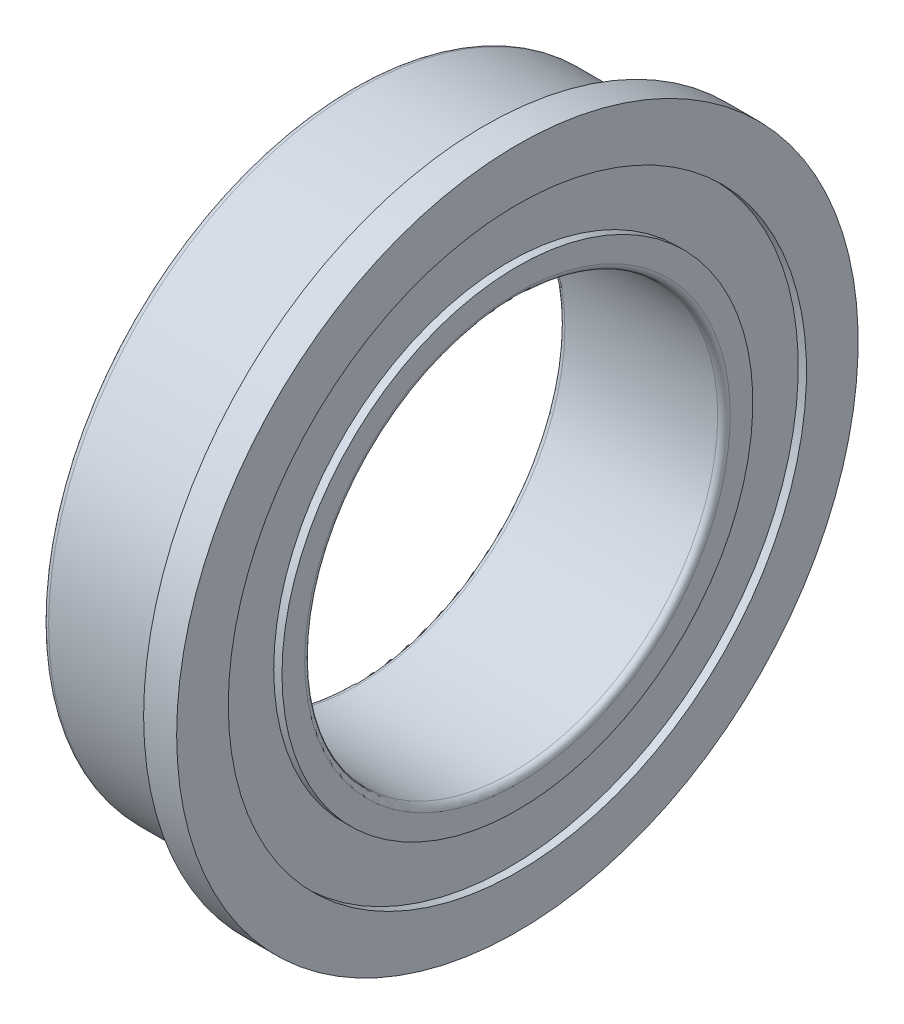
ISO-10303-21;
HEADER;
FILE_DESCRIPTION(('STEP AP214'),'2;1');
FILE_NAME('part.step','',(''),(''),'','','');
FILE_SCHEMA(('AUTOMOTIVE_DESIGN { 1 0 10303 214 1 1 1 1 }'));
ENDSEC;
DATA;
#1=APPLICATION_CONTEXT('core data for automotive mechanical design processes');
#2=APPLICATION_PROTOCOL_DEFINITION('international standard','automotive_design',2000,#1);
#3=PRODUCT_CONTEXT('',#1,'mechanical');
#4=PRODUCT('Part','Part','',(#3));
#5=PRODUCT_RELATED_PRODUCT_CATEGORY('part','',(#4));
#6=PRODUCT_DEFINITION_FORMATION('','',#4);
#7=PRODUCT_DEFINITION_CONTEXT('part definition',#1,'design');
#8=PRODUCT_DEFINITION('design','',#6,#7);
#9=PRODUCT_DEFINITION_SHAPE('','',#8);
#10=(LENGTH_UNIT() NAMED_UNIT(*) SI_UNIT(.MILLI.,.METRE.));
#11=(NAMED_UNIT(*) PLANE_ANGLE_UNIT() SI_UNIT($,.RADIAN.));
#12=(NAMED_UNIT(*) SI_UNIT($,.STERADIAN.) SOLID_ANGLE_UNIT());
#13=UNCERTAINTY_MEASURE_WITH_UNIT(LENGTH_MEASURE(1.E-05),#10,'distance_accuracy_value','');
#14=(GEOMETRIC_REPRESENTATION_CONTEXT(3) GLOBAL_UNCERTAINTY_ASSIGNED_CONTEXT((#13)) GLOBAL_UNIT_ASSIGNED_CONTEXT((#10,
#11,#12)) REPRESENTATION_CONTEXT('',''));
#15=CARTESIAN_POINT('',(0.,0.,0.));
#16=DIRECTION('',(0.,0.,1.));
#17=DIRECTION('',(1.,0.,0.));
#18=AXIS2_PLACEMENT_3D('',#15,#16,#17);
#19=CARTESIAN_POINT('',(-3.2,0.,0.));
#20=DIRECTION('',(-1.,0.,0.));
#21=DIRECTION('',(0.,0.,1.));
#22=AXIS2_PLACEMENT_3D('',#19,#20,#21);
#23=CYLINDRICAL_SURFACE('',#22,8.25);
#24=CARTESIAN_POINT('',(0.,0.,0.));
#25=DIRECTION('',(-1.,0.,0.));
#26=DIRECTION('',(0.,0.,1.));
#27=AXIS2_PLACEMENT_3D('',#24,#25,#26);
#28=CIRCLE('',#27,8.25);
#29=CARTESIAN_POINT('',(0.,0.,8.25));
#30=VERTEX_POINT('',#29);
#31=EDGE_CURVE('E75',#30,#30,#28,.T.);
#32=ORIENTED_EDGE('',*,*,#31,.F.);
#33=EDGE_LOOP('',(#32));
#34=FACE_BOUND('',#33,.T.);
#35=CARTESIAN_POINT('',(0.799999999999999,0.,0.));
#36=DIRECTION('',(-1.,0.,0.));
#37=DIRECTION('',(0.,0.,1.));
#38=AXIS2_PLACEMENT_3D('',#35,#36,#37);
#39=CIRCLE('',#38,8.25);
#40=CARTESIAN_POINT('',(0.799999999999999,0.,8.25));
#41=VERTEX_POINT('',#40);
#42=EDGE_CURVE('E118',#41,#41,#39,.T.);
#43=ORIENTED_EDGE('',*,*,#42,.T.);
#44=EDGE_LOOP('',(#43));
#45=FACE_BOUND('',#44,.T.);
#46=ADVANCED_FACE('F41',(#34,#45),#23,.T.);
#47=CARTESIAN_POINT('',(0.,7.7,0.));
#48=DIRECTION('',(1.,0.,0.));
#49=DIRECTION('',(0.,0.,-1.));
#50=AXIS2_PLACEMENT_3D('',#47,#48,#49);
#51=PLANE('',#50);
#52=CARTESIAN_POINT('',(0.,0.,0.));
#53=DIRECTION('',(-1.,0.,0.));
#54=DIRECTION('',(0.,0.,1.));
#55=AXIS2_PLACEMENT_3D('',#52,#53,#54);
#56=CIRCLE('',#55,7.7);
#57=CARTESIAN_POINT('',(0.,0.,7.7));
#58=VERTEX_POINT('',#57);
#59=EDGE_CURVE('E79',#58,#58,#56,.T.);
#60=ORIENTED_EDGE('',*,*,#59,.F.);
#61=EDGE_LOOP('',(#60));
#62=FACE_BOUND('',#61,.T.);
#63=ORIENTED_EDGE('',*,*,#31,.T.);
#64=EDGE_LOOP('',(#63));
#65=FACE_BOUND('',#64,.T.);
#66=ADVANCED_FACE('F160',(#62,#65),#51,.F.);
#67=CARTESIAN_POINT('',(0.,0.,0.));
#68=DIRECTION('',(-1.,0.,0.));
#69=DIRECTION('',(0.,0.,1.));
#70=AXIS2_PLACEMENT_3D('',#67,#68,#69);
#71=TOROIDAL_SURFACE('',#70,7.5,0.2);
#72=CARTESIAN_POINT('',(-0.2,0.,0.));
#73=DIRECTION('',(-1.,0.,0.));
#74=DIRECTION('',(0.,0.,1.));
#75=AXIS2_PLACEMENT_3D('',#72,#73,#74);
#76=CIRCLE('',#75,7.5);
#77=CARTESIAN_POINT('',(-0.2,0.,7.5));
#78=VERTEX_POINT('',#77);
#79=EDGE_CURVE('E83',#78,#78,#76,.T.);
#80=ORIENTED_EDGE('',*,*,#79,.F.);
#81=EDGE_LOOP('',(#80));
#82=FACE_BOUND('',#81,.T.);
#83=ORIENTED_EDGE('',*,*,#59,.T.);
#84=EDGE_LOOP('',(#83));
#85=FACE_BOUND('',#84,.T.);
#86=ADVANCED_FACE('F166',(#82,#85),#71,.F.);
#87=CARTESIAN_POINT('',(-3.2,0.,0.));
#88=DIRECTION('',(-1.,0.,0.));
#89=DIRECTION('',(0.,0.,1.));
#90=AXIS2_PLACEMENT_3D('',#87,#88,#89);
#91=CYLINDRICAL_SURFACE('',#90,7.5);
#92=CARTESIAN_POINT('',(-3.05,0.,0.));
#93=DIRECTION('',(1.,0.,0.));
#94=DIRECTION('',(0.,0.,-1.));
#95=AXIS2_PLACEMENT_3D('',#92,#93,#94);
#96=CIRCLE('',#95,7.5);
#97=CARTESIAN_POINT('',(-3.05,0.,-7.5));
#98=VERTEX_POINT('',#97);
#99=EDGE_CURVE('E10',#98,#98,#96,.T.);
#100=ORIENTED_EDGE('',*,*,#99,.T.);
#101=EDGE_LOOP('',(#100));
#102=FACE_BOUND('',#101,.T.);
#103=ORIENTED_EDGE('',*,*,#79,.T.);
#104=EDGE_LOOP('',(#103));
#105=FACE_BOUND('',#104,.T.);
#106=ADVANCED_FACE('F211',(#102,#105),#91,.T.);
#107=CARTESIAN_POINT('',(-3.2,7.,0.));
#108=DIRECTION('',(1.,0.,0.));
#109=DIRECTION('',(0.,0.,-1.));
#110=AXIS2_PLACEMENT_3D('',#107,#108,#109);
#111=PLANE('',#110);
#112=CARTESIAN_POINT('',(-3.2,0.,0.));
#113=DIRECTION('',(1.,0.,0.));
#114=DIRECTION('',(0.,0.,-1.));
#115=AXIS2_PLACEMENT_3D('',#112,#113,#114);
#116=CIRCLE('',#115,7.35);
#117=CARTESIAN_POINT('',(-3.2,0.,-7.35));
#118=VERTEX_POINT('',#117);
#119=EDGE_CURVE('E49',#118,#118,#116,.F.);
#120=ORIENTED_EDGE('',*,*,#119,.T.);
#121=EDGE_LOOP('',(#120));
#122=FACE_BOUND('',#121,.T.);
#123=CARTESIAN_POINT('',(-3.2,0.,0.));
#124=DIRECTION('',(-1.,0.,0.));
#125=DIRECTION('',(0.,0.,1.));
#126=AXIS2_PLACEMENT_3D('',#123,#124,#125);
#127=CIRCLE('',#126,7.);
#128=CARTESIAN_POINT('',(-3.2,0.,7.));
#129=VERTEX_POINT('',#128);
#130=EDGE_CURVE('E87',#129,#129,#127,.T.);
#131=ORIENTED_EDGE('',*,*,#130,.F.);
#132=EDGE_LOOP('',(#131));
#133=FACE_BOUND('',#132,.T.);
#134=ADVANCED_FACE('F206',(#122,#133),#111,.F.);
#135=CARTESIAN_POINT('',(-3.2,0.,0.));
#136=DIRECTION('',(-1.,0.,0.));
#137=DIRECTION('',(0.,0.,1.));
#138=AXIS2_PLACEMENT_3D('',#135,#136,#137);
#139=CYLINDRICAL_SURFACE('',#138,7.);
#140=CARTESIAN_POINT('',(-3.,0.,0.));
#141=DIRECTION('',(-1.,0.,0.));
#142=DIRECTION('',(0.,0.,1.));
#143=AXIS2_PLACEMENT_3D('',#140,#141,#142);
#144=CIRCLE('',#143,7.);
#145=CARTESIAN_POINT('',(-3.,0.,7.));
#146=VERTEX_POINT('',#145);
#147=EDGE_CURVE('E90',#146,#146,#144,.T.);
#148=ORIENTED_EDGE('',*,*,#147,.F.);
#149=EDGE_LOOP('',(#148));
#150=FACE_BOUND('',#149,.T.);
#151=ORIENTED_EDGE('',*,*,#130,.T.);
#152=EDGE_LOOP('',(#151));
#153=FACE_BOUND('',#152,.T.);
#154=ADVANCED_FACE('F200',(#150,#153),#139,.F.);
#155=CARTESIAN_POINT('',(-3.,7.,0.));
#156=DIRECTION('',(1.,0.,0.));
#157=DIRECTION('',(0.,0.,-1.));
#158=AXIS2_PLACEMENT_3D('',#155,#156,#157);
#159=PLANE('',#158);
#160=CARTESIAN_POINT('',(-3.,0.,0.));
#161=DIRECTION('',(-1.,0.,0.));
#162=DIRECTION('',(0.,0.,1.));
#163=AXIS2_PLACEMENT_3D('',#160,#161,#162);
#164=CIRCLE('',#163,5.7);
#165=CARTESIAN_POINT('',(-3.,0.,5.7));
#166=VERTEX_POINT('',#165);
#167=EDGE_CURVE('E94',#166,#166,#164,.T.);
#168=ORIENTED_EDGE('',*,*,#167,.F.);
#169=EDGE_LOOP('',(#168));
#170=FACE_BOUND('',#169,.T.);
#171=ORIENTED_EDGE('',*,*,#147,.T.);
#172=EDGE_LOOP('',(#171));
#173=FACE_BOUND('',#172,.T.);
#174=ADVANCED_FACE('F194',(#170,#173),#159,.F.);
#175=CARTESIAN_POINT('',(-3.2,0.,0.));
#176=DIRECTION('',(-1.,0.,0.));
#177=DIRECTION('',(0.,0.,1.));
#178=AXIS2_PLACEMENT_3D('',#175,#176,#177);
#179=CYLINDRICAL_SURFACE('',#178,5.7);
#180=CARTESIAN_POINT('',(-3.2,0.,0.));
#181=DIRECTION('',(-1.,0.,0.));
#182=DIRECTION('',(0.,0.,1.));
#183=AXIS2_PLACEMENT_3D('',#180,#181,#182);
#184=CIRCLE('',#183,5.7);
#185=CARTESIAN_POINT('',(-3.2,0.,5.7));
#186=VERTEX_POINT('',#185);
#187=EDGE_CURVE('E98',#186,#186,#184,.T.);
#188=ORIENTED_EDGE('',*,*,#187,.F.);
#189=EDGE_LOOP('',(#188));
#190=FACE_BOUND('',#189,.T.);
#191=ORIENTED_EDGE('',*,*,#167,.T.);
#192=EDGE_LOOP('',(#191));
#193=FACE_BOUND('',#192,.T.);
#194=ADVANCED_FACE('F188',(#190,#193),#179,.T.);
#195=CARTESIAN_POINT('',(-3.2,5.,0.));
#196=DIRECTION('',(1.,0.,0.));
#197=DIRECTION('',(0.,0.,-1.));
#198=AXIS2_PLACEMENT_3D('',#195,#196,#197);
#199=PLANE('',#198);
#200=CARTESIAN_POINT('',(-3.2,0.,0.));
#201=DIRECTION('',(1.,0.,0.));
#202=DIRECTION('',(0.,0.,-1.));
#203=AXIS2_PLACEMENT_3D('',#200,#201,#202);
#204=CIRCLE('',#203,5.15);
#205=CARTESIAN_POINT('',(-3.2,0.,-5.15));
#206=VERTEX_POINT('',#205);
#207=EDGE_CURVE('E55',#206,#206,#204,.T.);
#208=ORIENTED_EDGE('',*,*,#207,.T.);
#209=EDGE_LOOP('',(#208));
#210=FACE_BOUND('',#209,.T.);
#211=ORIENTED_EDGE('',*,*,#187,.T.);
#212=EDGE_LOOP('',(#211));
#213=FACE_BOUND('',#212,.T.);
#214=ADVANCED_FACE('F156',(#210,#213),#199,.F.);
#215=CARTESIAN_POINT('',(-3.2,0.,0.));
#216=DIRECTION('',(-1.,0.,0.));
#217=DIRECTION('',(0.,0.,1.));
#218=AXIS2_PLACEMENT_3D('',#215,#216,#217);
#219=CYLINDRICAL_SURFACE('',#218,5.);
#220=CARTESIAN_POINT('',(0.65,0.,0.));
#221=DIRECTION('',(-1.,0.,0.));
#222=DIRECTION('',(0.,0.,1.));
#223=AXIS2_PLACEMENT_3D('',#220,#221,#222);
#224=CIRCLE('',#223,5.);
#225=CARTESIAN_POINT('',(0.65,0.,5.));
#226=VERTEX_POINT('',#225);
#227=EDGE_CURVE('E61',#226,#226,#224,.F.);
#228=ORIENTED_EDGE('',*,*,#227,.T.);
#229=EDGE_LOOP('',(#228));
#230=FACE_BOUND('',#229,.T.);
#231=CARTESIAN_POINT('',(-3.05,0.,0.));
#232=DIRECTION('',(1.,0.,0.));
#233=DIRECTION('',(0.,0.,-1.));
#234=AXIS2_PLACEMENT_3D('',#231,#232,#233);
#235=CIRCLE('',#234,5.);
#236=CARTESIAN_POINT('',(-3.05,0.,-5.));
#237=VERTEX_POINT('',#236);
#238=EDGE_CURVE('E67',#237,#237,#235,.F.);
#239=ORIENTED_EDGE('',*,*,#238,.T.);
#240=EDGE_LOOP('',(#239));
#241=FACE_BOUND('',#240,.T.);
#242=ADVANCED_FACE('F150',(#230,#241),#219,.F.);
#243=CARTESIAN_POINT('',(0.8,5.7,0.));
#244=DIRECTION('',(-1.,0.,0.));
#245=DIRECTION('',(0.,0.,1.));
#246=AXIS2_PLACEMENT_3D('',#243,#244,#245);
#247=PLANE('',#246);
#248=CARTESIAN_POINT('',(0.8,0.,0.));
#249=DIRECTION('',(-1.,0.,0.));
#250=DIRECTION('',(0.,0.,1.));
#251=AXIS2_PLACEMENT_3D('',#248,#249,#250);
#252=CIRCLE('',#251,5.15);
#253=CARTESIAN_POINT('',(0.8,0.,5.15));
#254=VERTEX_POINT('',#253);
#255=EDGE_CURVE('E71',#254,#254,#252,.T.);
#256=ORIENTED_EDGE('',*,*,#255,.T.);
#257=EDGE_LOOP('',(#256));
#258=FACE_BOUND('',#257,.T.);
#259=CARTESIAN_POINT('',(0.8,0.,0.));
#260=DIRECTION('',(-1.,0.,0.));
#261=DIRECTION('',(0.,0.,1.));
#262=AXIS2_PLACEMENT_3D('',#259,#260,#261);
#263=CIRCLE('',#262,5.7);
#264=CARTESIAN_POINT('',(0.8,0.,5.7));
#265=VERTEX_POINT('',#264);
#266=EDGE_CURVE('E102',#265,#265,#263,.T.);
#267=ORIENTED_EDGE('',*,*,#266,.F.);
#268=EDGE_LOOP('',(#267));
#269=FACE_BOUND('',#268,.T.);
#270=ADVANCED_FACE('F145',(#258,#269),#247,.F.);
#271=CARTESIAN_POINT('',(-3.2,0.,0.));
#272=DIRECTION('',(-1.,0.,0.));
#273=DIRECTION('',(0.,0.,1.));
#274=AXIS2_PLACEMENT_3D('',#271,#272,#273);
#275=CYLINDRICAL_SURFACE('',#274,5.7);
#276=CARTESIAN_POINT('',(0.599999999999999,0.,0.));
#277=DIRECTION('',(-1.,0.,0.));
#278=DIRECTION('',(0.,0.,1.));
#279=AXIS2_PLACEMENT_3D('',#276,#277,#278);
#280=CIRCLE('',#279,5.7);
#281=CARTESIAN_POINT('',(0.599999999999999,0.,5.7));
#282=VERTEX_POINT('',#281);
#283=EDGE_CURVE('E106',#282,#282,#280,.T.);
#284=ORIENTED_EDGE('',*,*,#283,.F.);
#285=EDGE_LOOP('',(#284));
#286=FACE_BOUND('',#285,.T.);
#287=ORIENTED_EDGE('',*,*,#266,.T.);
#288=EDGE_LOOP('',(#287));
#289=FACE_BOUND('',#288,.T.);
#290=ADVANCED_FACE('F139',(#286,#289),#275,.T.);
#291=CARTESIAN_POINT('',(0.599999999999998,7.,0.));
#292=DIRECTION('',(-1.,0.,0.));
#293=DIRECTION('',(0.,0.,1.));
#294=AXIS2_PLACEMENT_3D('',#291,#292,#293);
#295=PLANE('',#294);
#296=CARTESIAN_POINT('',(0.599999999999999,0.,0.));
#297=DIRECTION('',(-1.,0.,0.));
#298=DIRECTION('',(0.,0.,1.));
#299=AXIS2_PLACEMENT_3D('',#296,#297,#298);
#300=CIRCLE('',#299,7.);
#301=CARTESIAN_POINT('',(0.599999999999999,0.,7.));
#302=VERTEX_POINT('',#301);
#303=EDGE_CURVE('E110',#302,#302,#300,.T.);
#304=ORIENTED_EDGE('',*,*,#303,.F.);
#305=EDGE_LOOP('',(#304));
#306=FACE_BOUND('',#305,.T.);
#307=ORIENTED_EDGE('',*,*,#283,.T.);
#308=EDGE_LOOP('',(#307));
#309=FACE_BOUND('',#308,.T.);
#310=ADVANCED_FACE('F133',(#306,#309),#295,.F.);
#311=CARTESIAN_POINT('',(-3.2,0.,0.));
#312=DIRECTION('',(-1.,0.,0.));
#313=DIRECTION('',(0.,0.,1.));
#314=AXIS2_PLACEMENT_3D('',#311,#312,#313);
#315=CYLINDRICAL_SURFACE('',#314,7.);
#316=CARTESIAN_POINT('',(0.8,0.,0.));
#317=DIRECTION('',(-1.,0.,0.));
#318=DIRECTION('',(0.,0.,1.));
#319=AXIS2_PLACEMENT_3D('',#316,#317,#318);
#320=CIRCLE('',#319,7.);
#321=CARTESIAN_POINT('',(0.8,0.,7.));
#322=VERTEX_POINT('',#321);
#323=EDGE_CURVE('E114',#322,#322,#320,.T.);
#324=ORIENTED_EDGE('',*,*,#323,.F.);
#325=EDGE_LOOP('',(#324));
#326=FACE_BOUND('',#325,.T.);
#327=ORIENTED_EDGE('',*,*,#303,.T.);
#328=EDGE_LOOP('',(#327));
#329=FACE_BOUND('',#328,.T.);
#330=ADVANCED_FACE('F127',(#326,#329),#315,.F.);
#331=CARTESIAN_POINT('',(0.8,8.25,0.));
#332=DIRECTION('',(-1.,0.,0.));
#333=DIRECTION('',(0.,0.,1.));
#334=AXIS2_PLACEMENT_3D('',#331,#332,#333);
#335=PLANE('',#334);
#336=ORIENTED_EDGE('',*,*,#42,.F.);
#337=EDGE_LOOP('',(#336));
#338=FACE_BOUND('',#337,.T.);
#339=ORIENTED_EDGE('',*,*,#323,.T.);
#340=EDGE_LOOP('',(#339));
#341=FACE_BOUND('',#340,.T.);
#342=ADVANCED_FACE('F123',(#338,#341),#335,.F.);
#343=CARTESIAN_POINT('',(0.65,0.,0.));
#344=DIRECTION('',(-1.,0.,0.));
#345=DIRECTION('',(0.,0.,1.));
#346=AXIS2_PLACEMENT_3D('',#343,#344,#345);
#347=TOROIDAL_SURFACE('',#346,5.15,0.15);
#348=ORIENTED_EDGE('',*,*,#227,.F.);
#349=EDGE_LOOP('',(#348));
#350=FACE_BOUND('',#349,.T.);
#351=ORIENTED_EDGE('',*,*,#255,.F.);
#352=EDGE_LOOP('',(#351));
#353=FACE_BOUND('',#352,.T.);
#354=ADVANCED_FACE('F126',(#350,#353),#347,.T.);
#355=CARTESIAN_POINT('',(-3.05,0.,0.));
#356=DIRECTION('',(1.,0.,0.));
#357=DIRECTION('',(0.,0.,-1.));
#358=AXIS2_PLACEMENT_3D('',#355,#356,#357);
#359=TOROIDAL_SURFACE('',#358,5.15,0.15);
#360=ORIENTED_EDGE('',*,*,#207,.F.);
#361=EDGE_LOOP('',(#360));
#362=FACE_BOUND('',#361,.T.);
#363=ORIENTED_EDGE('',*,*,#238,.F.);
#364=EDGE_LOOP('',(#363));
#365=FACE_BOUND('',#364,.T.);
#366=ADVANCED_FACE('F173',(#362,#365),#359,.T.);
#367=CARTESIAN_POINT('',(-3.05,0.,0.));
#368=DIRECTION('',(1.,0.,0.));
#369=DIRECTION('',(0.,0.,-1.));
#370=AXIS2_PLACEMENT_3D('',#367,#368,#369);
#371=TOROIDAL_SURFACE('',#370,7.35,0.15);
#372=ORIENTED_EDGE('',*,*,#99,.F.);
#373=EDGE_LOOP('',(#372));
#374=FACE_BOUND('',#373,.T.);
#375=ORIENTED_EDGE('',*,*,#119,.F.);
#376=EDGE_LOOP('',(#375));
#377=FACE_BOUND('',#376,.T.);
#378=ADVANCED_FACE('F43',(#374,#377),#371,.T.);
#379=CLOSED_SHELL('',(#46,#66,#86,#106,#134,#154,#174,#194,#214,#242,#270,#290,#310,#330,#342,
#354,#366,#378));
#380=MANIFOLD_SOLID_BREP('B2',#379);
#381=ADVANCED_BREP_SHAPE_REPRESENTATION('',(#18,#380),#14);
#382=SHAPE_DEFINITION_REPRESENTATION(#9,#381);
ENDSEC;
END-ISO-10303-21;
